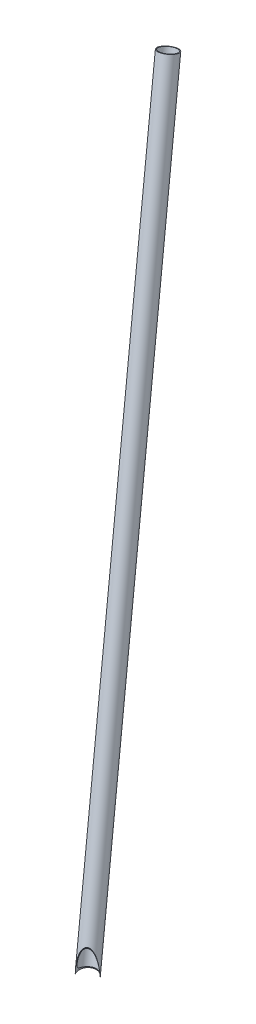
ISO-10303-21;
HEADER;
FILE_DESCRIPTION(('STEP AP214'),'2;1');
FILE_NAME('part.step','',(''),(''),'','','');
FILE_SCHEMA(('AUTOMOTIVE_DESIGN { 1 0 10303 214 1 1 1 1 }'));
ENDSEC;
DATA;
#1=APPLICATION_CONTEXT('core data for automotive mechanical design processes');
#2=APPLICATION_PROTOCOL_DEFINITION('international standard','automotive_design',2000,#1);
#3=PRODUCT_CONTEXT('',#1,'mechanical');
#4=PRODUCT('Part','Part','',(#3));
#5=PRODUCT_RELATED_PRODUCT_CATEGORY('part','',(#4));
#6=PRODUCT_DEFINITION_FORMATION('','',#4);
#7=PRODUCT_DEFINITION_CONTEXT('part definition',#1,'design');
#8=PRODUCT_DEFINITION('design','',#6,#7);
#9=PRODUCT_DEFINITION_SHAPE('','',#8);
#10=(LENGTH_UNIT() NAMED_UNIT(*) SI_UNIT(.MILLI.,.METRE.));
#11=(NAMED_UNIT(*) PLANE_ANGLE_UNIT() SI_UNIT($,.RADIAN.));
#12=(NAMED_UNIT(*) SI_UNIT($,.STERADIAN.) SOLID_ANGLE_UNIT());
#13=UNCERTAINTY_MEASURE_WITH_UNIT(LENGTH_MEASURE(1.E-05),#10,'distance_accuracy_value','');
#14=(GEOMETRIC_REPRESENTATION_CONTEXT(3) GLOBAL_UNCERTAINTY_ASSIGNED_CONTEXT((#13)) GLOBAL_UNIT_ASSIGNED_CONTEXT((#10,
#11,#12)) REPRESENTATION_CONTEXT('',''));
#15=CARTESIAN_POINT('',(0.,0.,0.));
#16=DIRECTION('',(0.,0.,1.));
#17=DIRECTION('',(1.,0.,0.));
#18=AXIS2_PLACEMENT_3D('',#15,#16,#17);
#19=CARTESIAN_POINT('',(250.,0.,-1700.));
#20=DIRECTION('',(-0.140336447675245,0.956366902675742,-0.256257739239816));
#21=DIRECTION('',(0.,0.258819045102517,0.965925826289069));
#22=AXIS2_PLACEMENT_3D('',#19,#20,#21);
#23=CYLINDRICAL_SURFACE('',#22,11.3);
#24=CARTESIAN_POINT('',(115.,920.,-1946.51325703663));
#25=DIRECTION('',(-0.140336447675245,0.956366902675742,-0.256257739239816));
#26=DIRECTION('',(0.,0.258819045102518,0.965925826289069));
#27=AXIS2_PLACEMENT_3D('',#24,#25,#26);
#28=CIRCLE('',#27,11.3);
#29=CARTESIAN_POINT('',(115.,922.924655209659,-1935.59829519956));
#30=VERTEX_POINT('',#29);
#31=EDGE_CURVE('E85',#30,#30,#28,.T.);
#32=ORIENTED_EDGE('',*,*,#31,.T.);
#33=EDGE_LOOP('',(#32));
#34=FACE_BOUND('',#33,.T.);
#35=CARTESIAN_POINT('',(246.006060690067,30.1426119884582,-1696.37806770144));
#36=CARTESIAN_POINT('',(245.821050136648,29.843463318067,-1696.29790856624));
#37=CARTESIAN_POINT('',(245.64368605481,29.5381531846331,-1696.22313214707));
#38=CARTESIAN_POINT('',(245.302090027863,28.9181333899522,-1696.08288735659));
#39=CARTESIAN_POINT('',(245.137862666532,28.6034204999695,-1696.0174222281));
#40=CARTESIAN_POINT('',(244.820668172786,27.966308664182,-1695.89463570045));
#41=CARTESIAN_POINT('',(244.667716313565,27.6439000487619,-1695.83732525294));
#42=CARTESIAN_POINT('',(244.371929884443,26.9933386431604,-1695.73009898255));
#43=CARTESIAN_POINT('',(244.229094142555,26.6651865238954,-1695.68018230235));
#44=CARTESIAN_POINT('',(243.952057650598,26.003463693692,-1695.58697096445));
#45=CARTESIAN_POINT('',(243.817877032508,25.6698824606316,-1695.54369144437));
#46=CARTESIAN_POINT('',(243.557535817385,24.9988629350306,-1695.46338375517));
#47=CARTESIAN_POINT('',(243.431375432422,24.661424540777,-1695.42635575132));
#48=CARTESIAN_POINT('',(243.186356288176,23.9836110091483,-1695.3582028183));
#49=CARTESIAN_POINT('',(243.067492153293,23.643238249792,-1695.32707350703));
#50=CARTESIAN_POINT('',(242.836266837495,22.9598224511067,-1695.27042377829));
#51=CARTESIAN_POINT('',(242.723905926522,22.6167793016025,-1695.24490359352));
#52=CARTESIAN_POINT('',(242.427670030987,21.6849897896911,-1695.18316779246));
#53=CARTESIAN_POINT('',(242.249432705698,21.0940958889353,-1695.15215680528));
#54=CARTESIAN_POINT('',(241.907501704627,19.907430626429,-1695.10578308397));
#55=CARTESIAN_POINT('',(241.74381062257,19.311658415433,-1695.09042313548));
#56=CARTESIAN_POINT('',(241.428482403642,18.1157761499205,-1695.07603817322));
#57=CARTESIAN_POINT('',(241.276863948639,17.5156608820433,-1695.07703800012));
#58=CARTESIAN_POINT('',(240.983803184783,16.3134297509507,-1695.09717445635));
#59=CARTESIAN_POINT('',(240.842357594228,15.7113145990559,-1695.11630520826));
#60=CARTESIAN_POINT('',(240.635507581886,14.8053308528975,-1695.16129999448));
#61=CARTESIAN_POINT('',(240.567195557267,14.5017128206471,-1695.17911347504));
#62=CARTESIAN_POINT('',(240.43221010878,13.8945419059899,-1695.22091917089));
#63=CARTESIAN_POINT('',(240.36553662392,13.5909890215763,-1695.24491115581));
#64=CARTESIAN_POINT('',(240.233368615922,12.9838303695599,-1695.30000061829));
#65=CARTESIAN_POINT('',(240.167875814254,12.6802250885162,-1695.33110768784));
#66=CARTESIAN_POINT('',(240.037747208365,12.0737965535612,-1695.40161577455));
#67=CARTESIAN_POINT('',(239.973111364978,11.7709732644215,-1695.44101641124));
#68=CARTESIAN_POINT('',(239.844490405538,11.1679354498811,-1695.52955157445));
#69=CARTESIAN_POINT('',(239.780503701887,10.86771531326,-1695.57864500281));
#70=CARTESIAN_POINT('',(239.652376786737,10.2694066684755,-1695.68884997528));
#71=CARTESIAN_POINT('',(239.588236542514,9.97131868119022,-1695.7499643587));
#72=CARTESIAN_POINT('',(239.459425152926,9.37937537136817,-1695.88697748534));
#73=CARTESIAN_POINT('',(239.39475556646,9.0855118956992,-1695.96284192815));
#74=CARTESIAN_POINT('',(239.264292171973,8.50359291667655,-1696.13328588937));
#75=CARTESIAN_POINT('',(239.198499136308,8.21553369821045,-1696.22785298856));
#76=CARTESIAN_POINT('',(239.081427479479,7.71612623443426,-1696.41532148033));
#77=CARTESIAN_POINT('',(239.030427511517,7.50286027022417,-1696.50324640214));
#78=CARTESIAN_POINT('',(238.927837796589,7.08381551892365,-1696.69540230648));
#79=CARTESIAN_POINT('',(238.876247988165,6.87803752157169,-1696.79963500285));
#80=CARTESIAN_POINT('',(238.773439948213,6.47825241406333,-1697.02612579738));
#81=CARTESIAN_POINT('',(238.722221440359,6.28417876100728,-1697.14826503));
#82=CARTESIAN_POINT('',(238.621082831227,5.90998185657682,-1697.41279328233));
#83=CARTESIAN_POINT('',(238.571162033931,5.72985102007204,-1697.55517117056));
#84=CARTESIAN_POINT('',(238.486293853675,5.42864439106263,-1697.82335733738));
#85=CARTESIAN_POINT('',(238.450655042041,5.30385273781231,-1697.94478851163));
#86=CARTESIAN_POINT('',(238.382264538395,5.06536310510523,-1698.19883246755));
#87=CARTESIAN_POINT('',(238.349512427946,4.95166351755201,-1698.33144362318));
#88=CARTESIAN_POINT('',(238.287904784141,4.73574842510727,-1698.60700852354));
#89=CARTESIAN_POINT('',(238.259057716715,4.63355794942707,-1698.74998373903));
#90=CARTESIAN_POINT('',(238.206345862896,4.44091950654691,-1699.04450804949));
#91=CARTESIAN_POINT('',(238.182481999765,4.3504737165128,-1699.19605872668));
#92=CARTESIAN_POINT('',(238.135764748301,4.1612351109664,-1699.54178023923));
#93=CARTESIAN_POINT('',(238.114410117961,4.06531802423542,-1699.73772774139));
#94=CARTESIAN_POINT('',(238.081711394222,3.88865954736213,-1700.13713119884));
#95=CARTESIAN_POINT('',(238.070370112656,3.80792242488592,-1700.34058924646));
#96=CARTESIAN_POINT('',(238.058457504998,3.65935678387529,-1700.75289658051));
#97=CARTESIAN_POINT('',(238.057908111237,3.59155483015555,-1700.96175598226));
#98=CARTESIAN_POINT('',(238.068106106375,3.46695705094146,-1701.38247983017));
#99=CARTESIAN_POINT('',(238.078856950949,3.41016459850598,-1701.59434517601));
#100=CARTESIAN_POINT('',(238.118164840153,3.28607189223925,-1702.09935439001));
#101=CARTESIAN_POINT('',(238.15189700124,3.22284945248673,-1702.3931071372));
#102=CARTESIAN_POINT('',(238.241624036823,3.10968758304951,-1702.97978997183));
#103=CARTESIAN_POINT('',(238.297626047407,3.05975241967128,-1703.27271976524));
#104=CARTESIAN_POINT('',(238.43191844369,2.97013604733803,-1703.85501171149));
#105=CARTESIAN_POINT('',(238.510209381415,2.93045509239354,-1704.14437377579));
#106=CARTESIAN_POINT('',(238.68889919742,2.85905967652988,-1704.71714937034));
#107=CARTESIAN_POINT('',(238.789295906122,2.82734443446678,-1705.00056348138));
#108=CARTESIAN_POINT('',(239.013555218476,2.76971871239668,-1705.56359892226));
#109=CARTESIAN_POINT('',(239.137750782057,2.74390361788604,-1705.84309744136));
#110=CARTESIAN_POINT('',(239.408062489349,2.69734984726242,-1706.39173259276));
#111=CARTESIAN_POINT('',(239.554179090049,2.67661127700383,-1706.66086900891));
#112=CARTESIAN_POINT('',(239.867602438539,2.6391996036637,-1707.1867417789));
#113=CARTESIAN_POINT('',(240.034905283145,2.6225257533817,-1707.44348040481));
#114=CARTESIAN_POINT('',(240.389837027473,2.59248024399081,-1707.94271346966));
#115=CARTESIAN_POINT('',(240.577466263628,2.57910863955118,-1708.18520767273));
#116=CARTESIAN_POINT('',(240.979970528992,2.55462222508675,-1708.66364651898));
#117=CARTESIAN_POINT('',(241.195641019861,2.54362068313656,-1708.89892866256));
#118=CARTESIAN_POINT('',(241.646403791861,2.52414139468129,-1709.35021938382));
#119=CARTESIAN_POINT('',(241.881496703313,2.51566373012525,-1709.56622733553));
#120=CARTESIAN_POINT('',(242.369471606477,2.50094425456332,-1709.97723651732));
#121=CARTESIAN_POINT('',(242.622354595815,2.49470256906555,-1710.17223656778));
#122=CARTESIAN_POINT('',(243.144053724141,2.48430468157568,-1710.53966452242));
#123=CARTESIAN_POINT('',(243.41286945094,2.48014842565876,-1710.71209301015));
#124=CARTESIAN_POINT('',(243.957992313122,2.47396944613453,-1711.02931427325));
#125=CARTESIAN_POINT('',(244.23397880361,2.47189925233391,-1711.1746575054));
#126=CARTESIAN_POINT('',(244.7972316478,2.46981461276311,-1711.44154425975));
#127=CARTESIAN_POINT('',(245.084497834151,2.46980013650485,-1711.56308813489));
#128=CARTESIAN_POINT('',(245.668167264153,2.4720315587306,-1711.78158659968));
#129=CARTESIAN_POINT('',(245.964568980528,2.47427708135384,-1711.87854527474));
#130=CARTESIAN_POINT('',(246.56440100203,2.48135792005074,-1712.0473714069));
#131=CARTESIAN_POINT('',(246.867831336948,2.48619324710311,-1712.11923875763));
#132=CARTESIAN_POINT('',(247.47929504545,2.49892210876154,-1712.23754870333));
#133=CARTESIAN_POINT('',(247.787324648617,2.50681325777865,-1712.28401106315));
#134=CARTESIAN_POINT('',(248.406035507307,2.52629820287723,-1712.35154646511));
#135=CARTESIAN_POINT('',(248.71671677988,2.53789202278468,-1712.37261934388));
#136=CARTESIAN_POINT('',(249.338775301971,2.56565125078647,-1712.38955660264));
#137=CARTESIAN_POINT('',(249.650152885383,2.58181983499245,-1712.38540342786));
#138=CARTESIAN_POINT('',(250.271224318542,2.61986602015547,-1712.3522433113));
#139=CARTESIAN_POINT('',(250.580918187445,2.64174355601648,-1712.32323665292));
#140=CARTESIAN_POINT('',(251.204198042581,2.69335900984978,-1712.23995195989));
#141=CARTESIAN_POINT('',(251.517686848735,2.72328030216425,-1712.18505837482));
#142=CARTESIAN_POINT('',(252.138331486699,2.79289576819807,-1712.0507101067));
#143=CARTESIAN_POINT('',(252.445486085579,2.83259182543755,-1711.97125068925));
#144=CARTESIAN_POINT('',(253.050639364389,2.9246574787219,-1711.78911865909));
#145=CARTESIAN_POINT('',(253.348644945966,2.97701724316951,-1711.68646405824));
#146=CARTESIAN_POINT('',(253.932822403373,3.09835161458044,-1711.4596888421));
#147=CARTESIAN_POINT('',(254.219000540782,3.16731729467796,-1711.33557977021));
#148=CARTESIAN_POINT('',(254.673662932533,3.2976817361311,-1711.11765201834));
#149=CARTESIAN_POINT('',(254.846748326689,3.35254652794539,-1711.02946412497));
#150=CARTESIAN_POINT('',(255.185713872771,3.47256998254157,-1710.84653458763));
#151=CARTESIAN_POINT('',(255.351596329933,3.53772532050281,-1710.751795066));
#152=CARTESIAN_POINT('',(255.674570805899,3.67985219362405,-1710.55720198351));
#153=CARTESIAN_POINT('',(255.831681251066,3.75679758250137,-1710.45736005683));
#154=CARTESIAN_POINT('',(256.136030566187,3.92422249777246,-1710.25399866689));
#155=CARTESIAN_POINT('',(256.283271218185,4.01469957136489,-1710.1504798727));
#156=CARTESIAN_POINT('',(256.545645264629,4.19614352035206,-1709.95703071085));
#157=CARTESIAN_POINT('',(256.662327049855,4.28510857822561,-1709.86732408914));
#158=CARTESIAN_POINT('',(256.886441786611,4.47421028189506,-1709.68812881138));
#159=CARTESIAN_POINT('',(256.993875960902,4.57434544669715,-1709.59864012803));
#160=CARTESIAN_POINT('',(257.198726669474,4.78561625479263,-1709.42137628622));
#161=CARTESIAN_POINT('',(257.296148881153,4.89674559275604,-1709.33360017976));
#162=CARTESIAN_POINT('',(257.480670549076,5.1293904557293,-1709.1610128309));
#163=CARTESIAN_POINT('',(257.567769576171,5.25090641216558,-1709.07620171185));
#164=CARTESIAN_POINT('',(257.731303936448,5.50262404845189,-1708.91092920045));
#165=CARTESIAN_POINT('',(257.807786147742,5.63278353234952,-1708.83044971411));
#166=CARTESIAN_POINT('',(257.950988299763,5.90093039862892,-1708.67402227709));
#167=CARTESIAN_POINT('',(258.017707872059,6.03891807616606,-1708.59807449749));
#168=CARTESIAN_POINT('',(258.142150581466,6.3214356999504,-1708.45087392389));
#169=CARTESIAN_POINT('',(258.199866299378,6.46597091617469,-1708.37962502941));
#170=CARTESIAN_POINT('',(258.307107577233,6.76018353150422,-1708.24181103283));
#171=CARTESIAN_POINT('',(258.356633134075,6.90986093255598,-1708.1752459325));
#172=CARTESIAN_POINT('',(258.461406776746,7.25621939146909,-1708.02828868296));
#173=CARTESIAN_POINT('',(258.5143051712,7.45421038050378,-1707.94931751357));
#174=CARTESIAN_POINT('',(258.60995914805,7.85506736856169,-1707.79775741141));
#175=CARTESIAN_POINT('',(258.652710230924,8.05793548645692,-1707.72517131885));
#176=CARTESIAN_POINT('',(258.729675707242,8.46745441357628,-1707.58537874564));
#177=CARTESIAN_POINT('',(258.763876490739,8.67411069853879,-1707.51818095585));
#178=CARTESIAN_POINT('',(258.824957039034,9.08994548792616,-1707.38840214953));
#179=CARTESIAN_POINT('',(258.851835852746,9.29912431633447,-1707.32582173356));
#180=CARTESIAN_POINT('',(258.899544189725,9.72133205030841,-1707.20390531064));
#181=CARTESIAN_POINT('',(258.920312197544,9.93437860976892,-1707.14460687196));
#182=CARTESIAN_POINT('',(258.956298845576,10.3617985655687,-1707.02921754969));
#183=CARTESIAN_POINT('',(258.971517374046,10.5761719885368,-1706.97312673071));
#184=CARTESIAN_POINT('',(258.997065069714,11.0056416449523,-1706.86361448783));
#185=CARTESIAN_POINT('',(259.007399372637,11.2207368785893,-1706.81019031309));
#186=CARTESIAN_POINT('',(259.023729402599,11.6515977514095,-1706.70544810321));
#187=CARTESIAN_POINT('',(259.029725127284,11.8673633909562,-1706.65413006922));
#188=CARTESIAN_POINT('',(259.040172163491,12.42608000392,-1706.52355376991));
#189=CARTESIAN_POINT('',(259.041653812408,12.7693844632626,-1706.44556647307));
#190=CARTESIAN_POINT('',(259.036000748653,13.4565688003975,-1706.29243264086));
#191=CARTESIAN_POINT('',(259.028865277346,13.8004487261911,-1706.21728635622));
#192=CARTESIAN_POINT('',(259.006803076322,14.4884468721935,-1706.06875639685));
#193=CARTESIAN_POINT('',(258.991873914696,14.8325651332808,-1705.99537327977));
#194=CARTESIAN_POINT('',(258.954781270053,15.5206183416549,-1705.84954241));
#195=CARTESIAN_POINT('',(258.932617525149,15.8645532818542,-1705.77709469127));
#196=CARTESIAN_POINT('',(258.881345059012,16.552853206289,-1705.63225484633));
#197=CARTESIAN_POINT('',(258.852218471537,16.8972169917551,-1705.55986335183));
#198=CARTESIAN_POINT('',(258.787245192078,17.5852409713799,-1705.4147378626));
#199=CARTESIAN_POINT('',(258.751398337749,17.9289011483382,-1705.34200385963));
#200=CARTESIAN_POINT('',(258.633934531707,18.9583055747587,-1705.1225458792));
#201=CARTESIAN_POINT('',(258.542379787084,19.6426675289042,-1704.97452580426));
#202=CARTESIAN_POINT('',(258.333078561042,20.99952510734,-1704.67286889746));
#203=CARTESIAN_POINT('',(258.215576889739,21.6720720657275,-1704.51929510279));
#204=CARTESIAN_POINT('',(258.017642638596,22.6749326072622,-1704.2813669871));
#205=CARTESIAN_POINT('',(257.948033977926,23.008295750796,-1704.20077859975));
#206=CARTESIAN_POINT('',(257.801146888126,23.6725937301199,-1704.03666354507));
#207=CARTESIAN_POINT('',(257.723868823087,24.0035286803835,-1703.95313701734));
#208=CARTESIAN_POINT('',(257.561356827932,24.6614710471378,-1703.78296039237));
#209=CARTESIAN_POINT('',(257.476148505389,24.9884875033632,-1703.696320868));
#210=CARTESIAN_POINT('',(257.296900095824,25.6390213606744,-1703.51918717529));
#211=CARTESIAN_POINT('',(257.202860690604,25.9625390297361,-1703.42869330482));
#212=CARTESIAN_POINT('',(257.005158767999,26.6051401373019,-1703.24334533658));
#213=CARTESIAN_POINT('',(256.901502060083,26.9242261206044,-1703.14849388832));
#214=CARTESIAN_POINT('',(256.683477933072,27.5571301707082,-1702.95375136636));
#215=CARTESIAN_POINT('',(256.569112415554,27.8709491611503,-1702.85386118883));
#216=CARTESIAN_POINT('',(256.396197013016,28.3169617386431,-1702.70621845137));
#217=CARTESIAN_POINT('',(256.342518624948,28.4518327158669,-1702.66081202956));
#218=CARTESIAN_POINT('',(256.232734992549,28.7201734991459,-1702.56882117051));
#219=CARTESIAN_POINT('',(256.176629802621,28.8536433365285,-1702.52223675969));
#220=CARTESIAN_POINT('',(256.00443692153,29.2517849831532,-1702.3805802132));
#221=CARTESIAN_POINT('',(255.884489803218,29.5141424482621,-1702.28362006326));
#222=CARTESIAN_POINT('',(255.632945608304,30.0311330214524,-1702.08394951475));
#223=CARTESIAN_POINT('',(255.501344130688,30.2857631623223,-1701.98123694933));
#224=CARTESIAN_POINT('',(255.224914606546,30.78493729378,-1701.76929506845));
#225=CARTESIAN_POINT('',(255.080090051618,31.0294839223369,-1701.66006747592));
#226=CARTESIAN_POINT('',(254.814396763097,31.444211325294,-1701.46318209157));
#227=CARTESIAN_POINT('',(254.696931008215,31.6173580537225,-1701.37719119916));
#228=CARTESIAN_POINT('',(254.452691211731,31.9545240043743,-1701.20070160289));
#229=CARTESIAN_POINT('',(254.325919879092,32.1185458587058,-1701.11020421336));
#230=CARTESIAN_POINT('',(254.06225857093,32.4349259601435,-1700.92443285222));
#231=CARTESIAN_POINT('',(253.925385306822,32.5873026575778,-1700.82916684967));
#232=CARTESIAN_POINT('',(253.640474543911,32.8775136147255,-1700.63347890366));
#233=CARTESIAN_POINT('',(253.492443787047,33.0153565375968,-1700.53306008533));
#234=CARTESIAN_POINT('',(253.147783100583,33.3032743339489,-1700.30240100792));
#235=CARTESIAN_POINT('',(252.947957868941,33.4484861056625,-1700.17074005203));
#236=CARTESIAN_POINT('',(252.529874815773,33.7011798929848,-1699.90005733689));
#237=CARTESIAN_POINT('',(252.311637246999,33.8087027104281,-1699.76104372645));
#238=CARTESIAN_POINT('',(251.971665670912,33.9344877046553,-1699.54834053862));
#239=CARTESIAN_POINT('',(251.855412851722,33.9706199418964,-1699.47624241256));
#240=CARTESIAN_POINT('',(251.61991574859,34.0294692826227,-1699.33151023825));
#241=CARTESIAN_POINT('',(251.500673123284,34.0521936598437,-1699.25887650227));
#242=CARTESIAN_POINT('',(251.260319958572,34.083445049762,-1699.11380612173));
#243=CARTESIAN_POINT('',(251.139210617355,34.0919808156204,-1699.0413693832));
#244=CARTESIAN_POINT('',(250.89630187027,34.0946026420772,-1698.89741182663));
#245=CARTESIAN_POINT('',(250.774502541527,34.0886902870461,-1698.82589090904));
#246=CARTESIAN_POINT('',(250.549933125394,34.0646619232417,-1698.69522726115));
#247=CARTESIAN_POINT('',(250.447079117288,34.048533160287,-1698.63585259038));
#248=CARTESIAN_POINT('',(250.242468566916,34.0065281272822,-1698.51864878874));
#249=CARTESIAN_POINT('',(250.140712354416,33.9806490078228,-1698.46082011497));
#250=CARTESIAN_POINT('',(249.838001363128,33.8892878503697,-1698.2901136025));
#251=CARTESIAN_POINT('',(249.639564908293,33.8100774332135,-1698.17999242556));
#252=CARTESIAN_POINT('',(249.16427955289,33.5781766211235,-1697.92016822306));
#253=CARTESIAN_POINT('',(248.893115068814,33.4084481417722,-1697.77541985683));
#254=CARTESIAN_POINT('',(248.504742591513,33.1201287337833,-1697.57242081048));
#255=CARTESIAN_POINT('',(248.378156024137,33.0182071596668,-1697.50701325795));
#256=CARTESIAN_POINT('',(248.130874302099,32.8049014787582,-1697.38061708138));
#257=CARTESIAN_POINT('',(248.010178055772,32.6935191359166,-1697.31962763751));
#258=CARTESIAN_POINT('',(247.712181887886,32.4020168899188,-1697.17066911602));
#259=CARTESIAN_POINT('',(247.53864553505,32.216656637413,-1697.08545879636));
#260=CARTESIAN_POINT('',(247.203459359072,31.8319773161877,-1696.92356909855));
#261=CARTESIAN_POINT('',(247.041815475711,31.6326513679341,-1696.84689397369));
#262=CARTESIAN_POINT('',(246.729009093173,31.2230040773635,-1696.70100804718));
#263=CARTESIAN_POINT('',(246.577858814814,31.0126703991513,-1696.63180589814));
#264=CARTESIAN_POINT('',(246.285087769907,30.5835603750689,-1696.5001028149));
#265=CARTESIAN_POINT('',(246.143465401181,30.364785458432,-1696.43760075299));
#266=CARTESIAN_POINT('',(246.006060690067,30.1426119884582,-1696.37806770144));
#267=B_SPLINE_CURVE_WITH_KNOTS('',3,(#35,#36,#37,#38,#39,#40,#41,#42,#43,#44,#45,#46,#47,#48,
#49,#50,#51,#52,#53,#54,#55,#56,#57,#58,#59,#60,#61,#62,#63,#64,#65,#66,#67,#68,#69,#70,#71,#72,
#73,#74,#75,#76,#77,#78,#79,#80,#81,#82,#83,#84,#85,#86,#87,#88,#89,#90,#91,#92,#93,#94,#95,#96,
#97,#98,#99,#100,#101,#102,#103,#104,#105,#106,#107,#108,#109,#110,#111,#112,#113,#114,#115,
#116,#117,#118,#119,#120,#121,#122,#123,#124,#125,#126,#127,#128,#129,#130,#131,#132,#133,#134,
#135,#136,#137,#138,#139,#140,#141,#142,#143,#144,#145,#146,#147,#148,#149,#150,#151,#152,#153,
#154,#155,#156,#157,#158,#159,#160,#161,#162,#163,#164,#165,#166,#167,#168,#169,#170,#171,#172,
#173,#174,#175,#176,#177,#178,#179,#180,#181,#182,#183,#184,#185,#186,#187,#188,#189,#190,#191,
#192,#193,#194,#195,#196,#197,#198,#199,#200,#201,#202,#203,#204,#205,#206,#207,#208,#209,#210,
#211,#212,#213,#214,#215,#216,#217,#218,#219,#220,#221,#222,#223,#224,#225,#226,#227,#228,#229,
#230,#231,#232,#233,#234,#235,#236,#237,#238,#239,#240,#241,#242,#243,#244,#245,#246,#247,#248,
#249,#250,#251,#252,#253,#254,#255,#256,#257,#258,#259,#260,#261,#262,#263,#264,#265,#266),
.UNSPECIFIED.,.T.,.F.,(4,2,2,2,2,2,2,2,2,2,2,2,2,2,2,2,2,2,2,2,2,2,2,2,2,2,2,2,2,2,2,2,2,2,2,2,
2,2,2,2,2,2,2,2,2,2,2,2,2,2,2,2,2,2,2,2,2,2,2,2,2,2,2,2,2,2,2,2,2,2,2,2,2,2,2,2,2,2,2,2,2,2,2,2,
2,2,2,2,2,2,2,2,2,2,2,2,2,2,2,2,2,2,2,2,2,2,2,2,2,2,2,2,2,2,2,4),(0.,1.08214674356419,
2.16466944690388,3.2486325150481,4.33246979620757,5.41874339128034,6.50504569767077,
7.59053780610617,8.67607493980864,10.5295167797519,12.3832884447047,14.2398751367586,
16.0958601937677,17.030960914301,17.9660267741642,18.9023607230871,19.8386517279163,
20.771054898816,21.7036785650041,22.6341588623321,23.5640233502078,24.2722317914942,
24.9805147106591,25.6842926645556,26.3876850202975,26.9202031978518,27.4526440573305,
27.9862213411531,28.5198973958505,29.1764946933658,29.8332763102675,30.4913925652666,
31.1497101344353,32.0555481102423,32.9616765843989,33.8678275024241,34.7738895255927,
35.693700347277,36.61353034699,37.5331911304833,38.4528671381034,39.4097721590605,
40.3667082468658,41.3236980402071,42.2806630865281,43.2153233090906,44.1499696698195,
45.0844606150414,46.0189555217908,46.9527223622095,47.8864952113611,48.8209179464305,
49.7553300272579,50.7131767580955,51.6712082030774,52.6284982447692,53.5852748191058,
54.1904234436397,54.7953769463515,55.3990077845177,56.0025293387241,56.5178986899811,
57.0331997917877,57.5482070549791,58.0632357203062,58.5759125790745,59.0886087807512,
59.6017252390544,60.1148418915941,60.773232980678,61.4319154705737,62.0916398375404,
62.7514498584045,63.4176909891965,64.0839455344304,64.7494979510893,65.4150507288623,
66.4710620428528,67.5271663329251,68.583600362122,69.6400726376635,70.6992854193778,
71.7585237926452,73.8764055700672,75.9750995031009,77.0248889515343,78.0746285871079,
79.1210889275377,80.1674685425385,81.2132201418956,82.2587863965097,82.7150492370458,
83.1713018544427,84.0839632643597,84.9969708027306,85.9097379518652,86.5880305128942,
87.2661263921388,87.9431246244616,88.6197170090415,89.4569109451709,90.2931957204203,
90.7170862781657,91.1407466642328,91.5641455909032,91.9874980900401,92.3466313066286,
92.7058695565296,93.4242105876827,94.4713605278908,94.9966524454226,95.5218466369066,
96.324359126599,97.1272697535358,97.9311002837885,98.7347953051434),.UNSPECIFIED.);
#268=CARTESIAN_POINT('',(246.006060690067,30.1426119884582,-1696.37806770144));
#269=VERTEX_POINT('',#268);
#270=EDGE_CURVE('E79',#269,#269,#267,.T.);
#271=ORIENTED_EDGE('',*,*,#270,.T.);
#272=EDGE_LOOP('',(#271));
#273=FACE_BOUND('',#272,.T.);
#274=ADVANCED_FACE('F41',(#34,#273),#23,.F.);
#275=CARTESIAN_POINT('',(115.,920.,-1946.51325703663));
#276=DIRECTION('',(-0.140336447675245,0.956366902675742,-0.256257739239816));
#277=DIRECTION('',(0.,0.258819045102518,0.965925826289069));
#278=AXIS2_PLACEMENT_3D('',#275,#276,#277);
#279=PLANE('',#278);
#280=ORIENTED_EDGE('',*,*,#31,.F.);
#281=EDGE_LOOP('',(#280));
#282=FACE_BOUND('',#281,.T.);
#283=CARTESIAN_POINT('',(115.,920.,-1946.51325703663));
#284=DIRECTION('',(-0.140336447675245,0.956366902675742,-0.256257739239816));
#285=DIRECTION('',(0.,0.258819045102518,0.965925826289069));
#286=AXIS2_PLACEMENT_3D('',#283,#284,#285);
#287=CIRCLE('',#286,12.5);
#288=CARTESIAN_POINT('',(115.,923.235238063782,-1934.43918420802));
#289=VERTEX_POINT('',#288);
#290=EDGE_CURVE('E57',#289,#289,#287,.T.);
#291=ORIENTED_EDGE('',*,*,#290,.T.);
#292=EDGE_LOOP('',(#291));
#293=FACE_BOUND('',#292,.T.);
#294=ADVANCED_FACE('F43',(#282,#293),#279,.T.);
#295=CARTESIAN_POINT('',(250.,0.,-1700.));
#296=DIRECTION('',(-0.140336447675245,0.956366902675742,-0.256257739239816));
#297=DIRECTION('',(0.,0.258819045102517,0.965925826289069));
#298=AXIS2_PLACEMENT_3D('',#295,#296,#297);
#299=CYLINDRICAL_SURFACE('',#298,12.5);
#300=ORIENTED_EDGE('',*,*,#290,.F.);
#301=EDGE_LOOP('',(#300));
#302=FACE_BOUND('',#301,.T.);
#303=CARTESIAN_POINT('',(250.,7.21644966006352E-13,-1700.));
#304=DIRECTION('',(-0.508456010272344,0.0599232902931692,-0.859000398660194));
#305=DIRECTION('',(0.0394871934442315,0.998148808069164,0.0462570913915508));
#306=AXIS2_PLACEMENT_3D('',#303,#304,#305);
#307=ELLIPSE('',#306,35.8382798156598,12.5);
#308=CARTESIAN_POINT('',(260.752276264615,-0.129997734684473,-1706.37351203956));
#309=VERTEX_POINT('',#308);
#310=CARTESIAN_POINT('',(239.247723735385,0.129997734685916,-1693.62648796044));
#311=VERTEX_POINT('',#310);
#312=EDGE_CURVE('E11',#309,#311,#307,.F.);
#313=ORIENTED_EDGE('',*,*,#312,.F.);
#314=CARTESIAN_POINT('',(250.,7.21644966006352E-13,-1700.));
#315=DIRECTION('',(0.0394871934442315,0.998148808069164,0.0462570913915508));
#316=DIRECTION('',(-0.508456010272344,0.0599232902931692,-0.859000398660194));
#317=AXIS2_PLACEMENT_3D('',#314,#315,#316);
#318=ELLIPSE('',#317,13.3375835216697,12.5);
#319=EDGE_CURVE('E49',#311,#309,#318,.F.);
#320=ORIENTED_EDGE('',*,*,#319,.F.);
#321=EDGE_LOOP('',(#313,#320));
#322=FACE_BOUND('',#321,.T.);
#323=ADVANCED_FACE('F58',(#302,#322),#299,.T.);
#324=CARTESIAN_POINT('',(325.,320.,-1580.));
#325=DIRECTION('',(-0.214351342090107,-0.914565726251124,-0.342962147344171));
#326=DIRECTION('',(0.,0.351123441588391,-0.936329177569045));
#327=AXIS2_PLACEMENT_3D('',#324,#325,#326);
#328=CYLINDRICAL_SURFACE('',#327,12.5);
#329=ORIENTED_EDGE('',*,*,#270,.F.);
#330=EDGE_LOOP('',(#329));
#331=FACE_BOUND('',#330,.T.);
#332=ORIENTED_EDGE('',*,*,#312,.T.);
#333=ORIENTED_EDGE('',*,*,#319,.T.);
#334=EDGE_LOOP('',(#332,#333));
#335=FACE_BOUND('',#334,.T.);
#336=ADVANCED_FACE('F55',(#331,#335),#328,.F.);
#337=CLOSED_SHELL('',(#274,#294,#323,#336));
#338=MANIFOLD_SOLID_BREP('B2',#337);
#339=ADVANCED_BREP_SHAPE_REPRESENTATION('',(#18,#338),#14);
#340=SHAPE_DEFINITION_REPRESENTATION(#9,#339);
ENDSEC;
END-ISO-10303-21;
